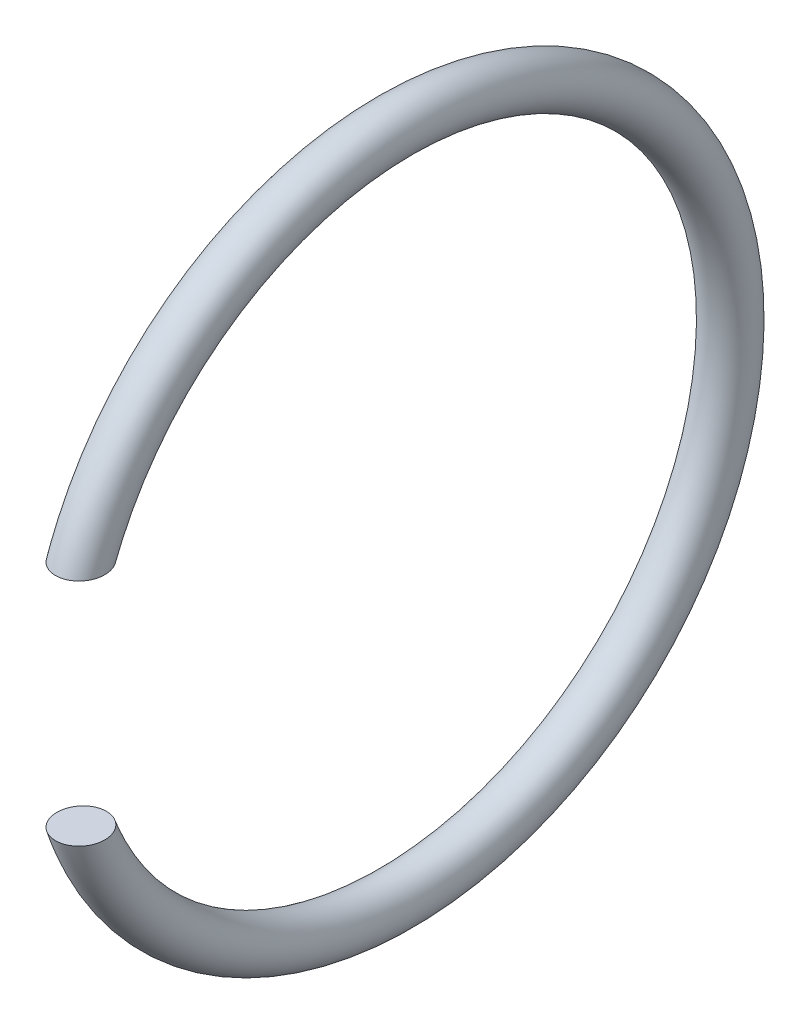
ISO-10303-21;
HEADER;
FILE_DESCRIPTION(('STEP AP214'),'2;1');
FILE_NAME('part.step','',(''),(''),'','','');
FILE_SCHEMA(('AUTOMOTIVE_DESIGN { 1 0 10303 214 1 1 1 1 }'));
ENDSEC;
DATA;
#1=APPLICATION_CONTEXT('core data for automotive mechanical design processes');
#2=APPLICATION_PROTOCOL_DEFINITION('international standard','automotive_design',2000,#1);
#3=PRODUCT_CONTEXT('',#1,'mechanical');
#4=PRODUCT('Part','Part','',(#3));
#5=PRODUCT_RELATED_PRODUCT_CATEGORY('part','',(#4));
#6=PRODUCT_DEFINITION_FORMATION('','',#4);
#7=PRODUCT_DEFINITION_CONTEXT('part definition',#1,'design');
#8=PRODUCT_DEFINITION('design','',#6,#7);
#9=PRODUCT_DEFINITION_SHAPE('','',#8);
#10=(LENGTH_UNIT() NAMED_UNIT(*) SI_UNIT(.MILLI.,.METRE.));
#11=(NAMED_UNIT(*) PLANE_ANGLE_UNIT() SI_UNIT($,.RADIAN.));
#12=(NAMED_UNIT(*) SI_UNIT($,.STERADIAN.) SOLID_ANGLE_UNIT());
#13=UNCERTAINTY_MEASURE_WITH_UNIT(LENGTH_MEASURE(1.E-05),#10,'distance_accuracy_value','');
#14=(GEOMETRIC_REPRESENTATION_CONTEXT(3) GLOBAL_UNCERTAINTY_ASSIGNED_CONTEXT((#13)) GLOBAL_UNIT_ASSIGNED_CONTEXT((#10,
#11,#12)) REPRESENTATION_CONTEXT('',''));
#15=CARTESIAN_POINT('',(0.,0.,0.));
#16=DIRECTION('',(0.,0.,1.));
#17=DIRECTION('',(1.,0.,0.));
#18=AXIS2_PLACEMENT_3D('',#15,#16,#17);
#19=CARTESIAN_POINT('',(19.0072424214337,6.00000000000001,0.));
#20=DIRECTION('',(0.,1.,0.));
#21=DIRECTION('',(1.,0.,0.));
#22=AXIS2_PLACEMENT_3D('',#19,#20,#21);
#23=PLANE('',#22);
#24=CARTESIAN_POINT('',(-1.25,5.99999999999559,16.4392822246093));
#25=CARTESIAN_POINT('',(-1.24999999948904,5.99999999999559,16.4460712429005));
#26=CARTESIAN_POINT('',(-1.2498375163337,6.00000000000493,16.4686717583032));
#27=CARTESIAN_POINT('',(-1.24860140865286,5.99999999999816,16.508364517218));
#28=CARTESIAN_POINT('',(-1.24493395243563,6.00000000000071,16.5638055618979));
#29=CARTESIAN_POINT('',(-1.23883028364897,5.99999999999984,16.6199431894502));
#30=CARTESIAN_POINT('',(-1.22902577685198,5.99999999999999,16.6846977017244));
#31=CARTESIAN_POINT('',(-1.21663679738193,5.99999999999998,16.7470604650045));
#32=CARTESIAN_POINT('',(-1.20392630441429,5.99999999999999,16.7975746310645));
#33=CARTESIAN_POINT('',(-1.18636390330316,6.00000000000014,16.85992718081));
#34=CARTESIAN_POINT('',(-1.16132027304933,5.99999999999999,16.9349301679153));
#35=CARTESIAN_POINT('',(-1.128845568859,6.00000000000002,17.0110969089417));
#36=CARTESIAN_POINT('',(-1.09309283359897,6.00000000000006,17.0848012242377));
#37=CARTESIAN_POINT('',(-1.05586562480863,6.00000000000009,17.152329374575));
#38=CARTESIAN_POINT('',(-1.0168176356841,6.00000000000001,17.2118660256357));
#39=CARTESIAN_POINT('',(-0.986069289496371,6.00000000000001,17.2550957746225));
#40=CARTESIAN_POINT('',(-0.96286079352189,5.99999999999996,17.2859775776734));
#41=CARTESIAN_POINT('',(-0.928749204176259,6.00000000000002,17.3277048826888));
#42=CARTESIAN_POINT('',(-0.896373854833484,6.00000000000009,17.3642750248076));
#43=CARTESIAN_POINT('',(-0.85235750577288,5.99999999999999,17.4102801790387));
#44=CARTESIAN_POINT('',(-0.805910789562093,6.00000000000014,17.4539332495049));
#45=CARTESIAN_POINT('',(-0.74383535463473,6.00000000000002,17.5058444568527));
#46=CARTESIAN_POINT('',(-0.699228858730718,6.00000000000001,17.5387954581922));
#47=CARTESIAN_POINT('',(-0.647344710545658,6.00000000000009,17.5736486098341));
#48=CARTESIAN_POINT('',(-0.590479318732028,6.00000000000001,17.6088780688781));
#49=CARTESIAN_POINT('',(-0.534339177089036,5.99999999999999,17.6380416156892));
#50=CARTESIAN_POINT('',(-0.455366618368598,6.00000000000002,17.6745047569591));
#51=CARTESIAN_POINT('',(-0.389296494541412,6.00000000000013,17.7001365067304));
#52=CARTESIAN_POINT('',(-0.306381112257153,6.00000000000007,17.7242757752179));
#53=CARTESIAN_POINT('',(-0.246322756055014,6.00000000000014,17.7387702159176));
#54=CARTESIAN_POINT('',(-0.189212607764413,6.00000000000014,17.7494240667185));
#55=CARTESIAN_POINT('',(-0.127871962660425,5.99999999999999,17.7575982363611));
#56=CARTESIAN_POINT('',(-0.0675128395648539,5.99999999999999,17.7627710643933));
#57=CARTESIAN_POINT('',(-0.0219897918912575,6.00000000000001,17.7641206372751));
#58=CARTESIAN_POINT('',(0.0152668271156502,6.00000000000001,17.7640542149836));
#59=CARTESIAN_POINT('',(0.0539435496721002,6.00000000000003,17.7633063054718));
#60=CARTESIAN_POINT('',(0.0993876858364148,6.00000000000009,17.7602779143511));
#61=CARTESIAN_POINT('',(0.161035341277552,6.0000000000001,17.7535706741527));
#62=CARTESIAN_POINT('',(0.226593051453221,6.00000000000001,17.7433014745263));
#63=CARTESIAN_POINT('',(0.303304200745962,6.00000000000001,17.7254566209559));
#64=CARTESIAN_POINT('',(0.39884776515698,6.00000000000001,17.6968448826941));
#65=CARTESIAN_POINT('',(0.464800435071022,6.00000000000001,17.6705696883647));
#66=CARTESIAN_POINT('',(0.555323762551591,6.00000000000001,17.6278339894727));
#67=CARTESIAN_POINT('',(0.629272937919354,6.00000000000001,17.5871509457439));
#68=CARTESIAN_POINT('',(0.711881502592455,5.99999999999999,17.5300373018721));
#69=CARTESIAN_POINT('',(0.775855005959964,6.00000000000007,17.4798302248649));
#70=CARTESIAN_POINT('',(0.825475300814275,6.00000000000003,17.4361592676733));
#71=CARTESIAN_POINT('',(0.874058191271728,6.00000000000014,17.3880733186771));
#72=CARTESIAN_POINT('',(0.900356829882116,6.00000000000001,17.3596570794839));
#73=CARTESIAN_POINT('',(0.934865045802702,6.00000000000001,17.3205993501469));
#74=CARTESIAN_POINT('',(0.985736140967527,5.99999999999999,17.2583061718641));
#75=CARTESIAN_POINT('',(1.0326122393575,6.00000000000006,17.188917794007));
#76=CARTESIAN_POINT('',(1.08526816935296,6.00000000000009,17.1003369248396));
#77=CARTESIAN_POINT('',(1.11505078526617,6.00000000000001,17.0421753076303));
#78=CARTESIAN_POINT('',(1.15598972169019,6.00000000000012,16.9470045458441));
#79=CARTESIAN_POINT('',(1.17620661392497,6.00000000000001,16.8914706091182));
#80=CARTESIAN_POINT('',(1.20260618288321,6.00000000000001,16.8045632253417));
#81=CARTESIAN_POINT('',(1.21515565440693,6.00000000000001,16.7539206106843));
#82=CARTESIAN_POINT('',(1.22964531669161,6.00000000000002,16.680410113966));
#83=CARTESIAN_POINT('',(1.23630913509142,6.0000000000001,16.6386183048956));
#84=CARTESIAN_POINT('',(1.24310234429961,5.99999999999998,16.5810368984034));
#85=CARTESIAN_POINT('',(1.24829996729937,5.99999999999998,16.5218207169747));
#86=CARTESIAN_POINT('',(1.25040141352334,6.0000000000001,16.4585602850266));
#87=CARTESIAN_POINT('',(1.2497686445754,6.00000000000006,16.4091204598925));
#88=CARTESIAN_POINT('',(1.24756988324158,6.00000000000005,16.3402709733002));
#89=CARTESIAN_POINT('',(1.24019556417104,5.99999999999999,16.260342759607));
#90=CARTESIAN_POINT('',(1.22285030808102,5.99999999999999,16.1595961332781));
#91=CARTESIAN_POINT('',(1.19987188305361,6.0000000000001,16.0591984923696));
#92=CARTESIAN_POINT('',(1.17032192100222,6.00000000000005,15.9668607113013));
#93=CARTESIAN_POINT('',(1.13190291068044,6.00000000000012,15.8716924274604));
#94=CARTESIAN_POINT('',(1.09389307052062,6.00000000000001,15.7907172225223));
#95=CARTESIAN_POINT('',(1.05582141705579,6.00000000000001,15.7238678988742));
#96=CARTESIAN_POINT('',(1.02065011407176,5.99999999999999,15.6684291649677));
#97=CARTESIAN_POINT('',(0.984589032858661,6.0000000000001,15.6152258357308));
#98=CARTESIAN_POINT('',(0.946684082851309,6.0000000000001,15.5666265674352));
#99=CARTESIAN_POINT('',(0.889288572614047,6.00000000000007,15.4994098248974));
#100=CARTESIAN_POINT('',(0.8503276643861,5.99999999999998,15.4588597269477));
#101=CARTESIAN_POINT('',(0.79095947961293,5.99999999999996,15.404412789397));
#102=CARTESIAN_POINT('',(0.747437072664513,6.00000000000005,15.3673219510643));
#103=CARTESIAN_POINT('',(0.696156358110354,6.00000000000009,15.3288578773022));
#104=CARTESIAN_POINT('',(0.63844142213949,6.00000000000007,15.2895143555653));
#105=CARTESIAN_POINT('',(0.567277984842088,5.99999999999999,15.2463303012472));
#106=CARTESIAN_POINT('',(0.494983296001193,6.00000000000007,15.2107257603079));
#107=CARTESIAN_POINT('',(0.416902079485946,5.99999999999999,15.1779544021765));
#108=CARTESIAN_POINT('',(0.352623404825367,6.00000000000001,15.1551673569665));
#109=CARTESIAN_POINT('',(0.294069088076967,6.00000000000007,15.1392380529122));
#110=CARTESIAN_POINT('',(0.234961665800972,6.00000000000012,15.125108614014));
#111=CARTESIAN_POINT('',(0.176359524617788,6.00000000000003,15.1140690836359));
#112=CARTESIAN_POINT('',(0.091706106613753,5.99999999999999,15.1045938885112));
#113=CARTESIAN_POINT('',(0.0377290170455666,6.00000000000001,15.1019618172897));
#114=CARTESIAN_POINT('',(-0.0136900358494313,6.00000000000007,15.1016069073221));
#115=CARTESIAN_POINT('',(-0.0502432405596574,6.00000000000006,15.1025056454128));
#116=CARTESIAN_POINT('',(-0.105708581606617,6.00000000000003,15.1061081296094));
#117=CARTESIAN_POINT('',(-0.146138454219426,6.00000000000001,15.1106544312443));
#118=CARTESIAN_POINT('',(-0.206391354750073,5.99999999999999,15.119675015305));
#119=CARTESIAN_POINT('',(-0.250423763403295,5.99999999999999,15.128398461892));
#120=CARTESIAN_POINT('',(-0.329375538798471,6.00000000000002,15.1483511102142));
#121=CARTESIAN_POINT('',(-0.384138181286905,6.00000000000007,15.1658884482857));
#122=CARTESIAN_POINT('',(-0.467997256879491,6.00000000000001,15.198574705182));
#123=CARTESIAN_POINT('',(-0.530669764158658,6.00000000000002,15.2275761027376));
#124=CARTESIAN_POINT('',(-0.609789811641292,6.00000000000003,15.2716222866269));
#125=CARTESIAN_POINT('',(-0.676651076816526,6.0000000000001,15.3143434613796));
#126=CARTESIAN_POINT('',(-0.740889942559081,6.00000000000002,15.3622024704481));
#127=CARTESIAN_POINT('',(-0.802116097893213,6.0000000000001,15.41373833174));
#128=CARTESIAN_POINT('',(-0.844148974375094,5.99999999999999,15.4535917159131));
#129=CARTESIAN_POINT('',(-0.887822148566541,5.99999999999998,15.498748450617));
#130=CARTESIAN_POINT('',(-0.92457538101998,6.00000000000006,15.5397505816132));
#131=CARTESIAN_POINT('',(-0.964659277602267,6.00000000000003,15.5896545502311));
#132=CARTESIAN_POINT('',(-1.01789593665713,6.0000000000001,15.6621836277221));
#133=CARTESIAN_POINT('',(-1.05478938782263,6.00000000000009,15.721379490705));
#134=CARTESIAN_POINT('',(-1.10409983848162,6.00000000000005,15.8118496941983));
#135=CARTESIAN_POINT('',(-1.14045408921405,6.00000000000006,15.8885938785113));
#136=CARTESIAN_POINT('',(-1.17567875766014,6.00000000000001,15.984232468483));
#137=CARTESIAN_POINT('',(-1.20441633986481,6.00000000000009,16.0780450149446));
#138=CARTESIAN_POINT('',(-1.22050028634751,6.00000000000009,16.1473772685133));
#139=CARTESIAN_POINT('',(-1.23498240702462,6.00000000000005,16.2304340456679));
#140=CARTESIAN_POINT('',(-1.24150172626244,5.99999999999983,16.279472814796));
#141=CARTESIAN_POINT('',(-1.24594654092519,6.00000000000017,16.3308401844162));
#142=CARTESIAN_POINT('',(-1.24855320364324,5.99999999999909,16.3704312364456));
#143=CARTESIAN_POINT('',(-1.2498076803383,6.00000000000649,16.4055855569042));
#144=CARTESIAN_POINT('',(-1.25000000050705,5.99999999999562,16.4325452555965));
#145=CARTESIAN_POINT('',(-1.25,5.99999999999559,16.4392822246093));
#146=(BOUNDED_CURVE() B_SPLINE_CURVE(3,(#24,#25,#26,#27,#28,#29,#30,#31,#32,#33,#34,#35,#36,#37,
#38,#39,#40,#41,#42,#43,#44,#45,#46,#47,#48,#49,#50,#51,#52,#53,#54,#55,#56,#57,#58,#59,#60,#61,
#62,#63,#64,#65,#66,#67,#68,#69,#70,#71,#72,#73,#74,#75,#76,#77,#78,#79,#80,#81,#82,#83,#84,#85,
#86,#87,#88,#89,#90,#91,#92,#93,#94,#95,#96,#97,#98,#99,#100,#101,#102,#103,#104,#105,#106,#107,
#108,#109,#110,#111,#112,#113,#114,#115,#116,#117,#118,#119,#120,#121,#122,#123,#124,#125,#126,
#127,#128,#129,#130,#131,#132,#133,#134,#135,#136,#137,#138,#139,#140,#141,#142,#143,#144,#145),
.UNSPECIFIED.,.T.,.F.) B_SPLINE_CURVE_WITH_KNOTS((4,1,1,1,1,1,1,1,1,1,1,1,1,1,1,1,1,1,1,1,1,1,1,
1,1,1,1,1,1,1,1,1,1,1,1,1,1,1,1,1,1,1,1,1,1,1,1,1,1,1,1,1,1,1,1,1,1,1,1,1,1,1,1,1,1,1,1,1,1,1,1,
1,1,1,1,1,1,1,1,1,1,1,1,1,1,1,1,1,1,1,1,1,1,1,1,1,1,1,1,1,1,1,1,1,1,1,1,1,1,1,1,1,1,1,1,1,1,1,1,
4),(-1.,-0.99748830897155,-0.99163835053226,-0.985308579014227,-0.976934506326966,
-0.970753753334385,-0.961086944677412,-0.953427207013681,-0.951492728047378,-0.937127426517715,
-0.924204690570156,-0.920885337921734,-0.906827528706236,-0.895708722317726,-0.894563622545929,
-0.887204975546506,-0.881423617012446,-0.874631574188783,-0.869143060136722,-0.857876910282985,
-0.851070447776254,-0.839220379612082,-0.837379979216058,-0.827952973347545,-0.814490850400339,
-0.814003774790902,-0.795780955223598,-0.788330039149886,-0.782073686187945,-0.772935497867618,
-0.766853554933367,-0.759190393331602,-0.750536435607325,-0.750015885741572,-0.745410213923499,
-0.736230109431048,-0.733178526715649,-0.722475483504466,-0.711703403808293,-0.704068700493222,
-0.685599366292559,-0.685497426359722,-0.667044123470492,-0.654439555308334,-0.648385123826268,
-0.636969025216962,-0.630005367715742,-0.623107854335521,-0.622651460166256,-0.610727463780561,
-0.593378837929119,-0.59172382412497,-0.572611349379789,-0.569248276546373,-0.553403158980579,
-0.550773389555424,-0.535651247276882,-0.534122658361268,-0.523058621908672,-0.520004845796058,
-0.512676127646979,-0.501074984924984,-0.496604875806005,-0.494388172647357,-0.47559462610792,
-0.466955499842869,-0.456583992769286,-0.43751403206267,-0.431146601959221,-0.418626341648365,
-0.404449500567075,-0.402715005477825,-0.394340633653064,-0.380682281863096,-0.379935158215248,
-0.361644895236165,-0.359914514689259,-0.350139916619246,-0.340505839917953,-0.336216966196899,
-0.324307672963824,-0.30974217583042,-0.306444180790979,-0.292990965723837,-0.284547226283528,
-0.284009857433463,-0.270513285208211,-0.26251453234641,-0.252514672623392,-0.250537451894679,
-0.243496880590605,-0.238995462232974,-0.229983189252726,-0.228457305880736,-0.216462212502356,
-0.21339399139069,-0.198338424152624,-0.19522270029554,-0.180107031457011,-0.172828850176652,
-0.161740049854657,-0.150778071555076,-0.143218495978918,-0.132146842692462,-0.129366369045701,
-0.119982189605584,-0.111787644620184,-0.105697597802964,-0.0867074631441425,
-0.0860291757619638,-0.0675854336855771,-0.0553415553560228,-0.0483537720320262,
-0.0312968334159581,-0.029043484723384,-0.0171679990048407,-0.0130092642742092,
-0.00997378499525492,-0.00249243467949462,0.),
.UNSPECIFIED.) CURVE() GEOMETRIC_REPRESENTATION_ITEM() RATIONAL_B_SPLINE_CURVE((1.,1.,1.,1.,1.,
1.,1.,1.,1.,1.,1.,1.,1.,1.,1.,1.,1.,1.,1.,1.,1.,1.,1.,1.,1.,1.,1.,1.,1.,1.,1.,1.,1.,1.,1.,1.,1.,
1.,1.,1.,1.,1.,1.,1.,1.,1.,1.,1.,1.,1.,1.,1.,1.,1.,1.,1.,1.,1.,1.,1.,1.,1.,1.,1.,1.,1.,1.,1.,1.,
1.,1.,1.,1.,1.,1.,1.,1.,1.,1.,1.,1.,1.,1.,1.,1.,1.,1.,1.,1.,1.,1.,1.,1.,1.,1.,1.,1.,1.,1.,1.,1.,
1.,1.,1.,1.,1.,1.,1.,1.,1.,1.,1.,1.,1.,1.,1.,1.,1.,1.,1.,1.,1.)) REPRESENTATION_ITEM(''));
#147=CARTESIAN_POINT('',(-1.25,5.99999999999125,16.4392822227769));
#148=VERTEX_POINT('',#147);
#149=EDGE_CURVE('E13',#148,#148,#146,.T.);
#150=ORIENTED_EDGE('',*,*,#149,.F.);
#151=EDGE_LOOP('',(#150));
#152=FACE_BOUND('',#151,.T.);
#153=ADVANCED_FACE('F24',(#152),#23,.F.);
#154=CARTESIAN_POINT('',(-19.0072424214337,-6.00000000000001,0.));
#155=DIRECTION('',(0.,-1.,0.));
#156=DIRECTION('',(-1.,0.,0.));
#157=AXIS2_PLACEMENT_3D('',#154,#155,#156);
#158=PLANE('',#157);
#159=CARTESIAN_POINT('',(-1.25,-5.99999999999563,16.4392822246093));
#160=CARTESIAN_POINT('',(-1.25000000050705,-5.99999999999556,16.4325452555964));
#161=CARTESIAN_POINT('',(-1.2498076803383,-6.0000000000066,16.4055855569042));
#162=CARTESIAN_POINT('',(-1.24855320364324,-5.99999999999895,16.3704312364455));
#163=CARTESIAN_POINT('',(-1.24594654092519,-6.0000000000002,16.3308401844161));
#164=CARTESIAN_POINT('',(-1.24150172626244,-5.9999999999998,16.2794728147959));
#165=CARTESIAN_POINT('',(-1.23498240702462,-6.00000000000003,16.2304340456679));
#166=CARTESIAN_POINT('',(-1.2205002863475,-6.00000000000002,16.1473772685132));
#167=CARTESIAN_POINT('',(-1.2044163398648,-6.00000000000005,16.0780450149446));
#168=CARTESIAN_POINT('',(-1.17567875766014,-6.00000000000001,15.9842324684829));
#169=CARTESIAN_POINT('',(-1.14045408921405,-6.00000000000006,15.8885938785113));
#170=CARTESIAN_POINT('',(-1.10409983848161,-6.00000000000001,15.8118496941983));
#171=CARTESIAN_POINT('',(-1.05478938782263,-6.00000000000001,15.721379490705));
#172=CARTESIAN_POINT('',(-1.01789593665713,-6.00000000000003,15.662183627722));
#173=CARTESIAN_POINT('',(-0.964659277602264,-6.00000000000002,15.5896545502311));
#174=CARTESIAN_POINT('',(-0.92457538101998,-6.0000000000001,15.5397505816131));
#175=CARTESIAN_POINT('',(-0.887822148566541,-6.00000000000001,15.4987484506169));
#176=CARTESIAN_POINT('',(-0.844148974375097,-6.00000000000001,15.4535917159131));
#177=CARTESIAN_POINT('',(-0.802116097893216,-6.00000000000006,15.41373833174));
#178=CARTESIAN_POINT('',(-0.740889942559081,-6.00000000000001,15.362202470448));
#179=CARTESIAN_POINT('',(-0.676651076816522,-6.00000000000001,15.3143434613796));
#180=CARTESIAN_POINT('',(-0.609789811641292,-6.00000000000001,15.2716222866268));
#181=CARTESIAN_POINT('',(-0.530669764158661,-6.00000000000001,15.2275761027375));
#182=CARTESIAN_POINT('',(-0.467997256879491,-6.00000000000001,15.198574705182));
#183=CARTESIAN_POINT('',(-0.384138181286901,-6.00000000000005,15.1658884482858));
#184=CARTESIAN_POINT('',(-0.329375538798474,-5.99999999999996,15.1483511102141));
#185=CARTESIAN_POINT('',(-0.250423763403295,-6.00000000000001,15.128398461892));
#186=CARTESIAN_POINT('',(-0.206391354750077,-5.99999999999995,15.119675015305));
#187=CARTESIAN_POINT('',(-0.14613845421943,-6.00000000000001,15.1106544312442));
#188=CARTESIAN_POINT('',(-0.10570858160662,-5.99999999999988,15.1061081296093));
#189=CARTESIAN_POINT('',(-0.0502432405596608,-6.00000000000002,15.1025056454127));
#190=CARTESIAN_POINT('',(-0.0136900358494313,-6.00000000000005,15.1016069073221));
#191=CARTESIAN_POINT('',(0.0377290170455632,-5.99999999999995,15.1019618172897));
#192=CARTESIAN_POINT('',(0.0917061066137496,-6.00000000000001,15.1045938885111));
#193=CARTESIAN_POINT('',(0.176359524617788,-6.00000000000001,15.1140690836358));
#194=CARTESIAN_POINT('',(0.234961665800972,-6.00000000000001,15.125108614014));
#195=CARTESIAN_POINT('',(0.29406908807697,-5.99999999999999,15.1392380529121));
#196=CARTESIAN_POINT('',(0.352623404825361,-6.0000000000001,15.1551673569664));
#197=CARTESIAN_POINT('',(0.416902079485942,-6.00000000000001,15.1779544021765));
#198=CARTESIAN_POINT('',(0.494983296001193,-5.99999999999999,15.2107257603078));
#199=CARTESIAN_POINT('',(0.567277984842088,-5.99999999999995,15.2463303012471));
#200=CARTESIAN_POINT('',(0.638441422139487,-6.00000000000006,15.2895143555653));
#201=CARTESIAN_POINT('',(0.69615635811035,-6.00000000000006,15.3288578773022));
#202=CARTESIAN_POINT('',(0.747437072664514,-6.00000000000006,15.3673219510642));
#203=CARTESIAN_POINT('',(0.790959479612937,-6.00000000000001,15.4044127893969));
#204=CARTESIAN_POINT('',(0.850327664386081,-6.00000000000001,15.4588597269475));
#205=CARTESIAN_POINT('',(0.889288572614028,-6.00000000000001,15.4994098248974));
#206=CARTESIAN_POINT('',(0.946684082851297,-6.00000000000005,15.5666265674352));
#207=CARTESIAN_POINT('',(0.984589032858651,-6.00000000000001,15.6152258357307));
#208=CARTESIAN_POINT('',(1.02065011407174,-6.00000000000001,15.6684291649676));
#209=CARTESIAN_POINT('',(1.05582141705578,-5.99999999999995,15.7238678988742));
#210=CARTESIAN_POINT('',(1.09389307052061,-5.99999999999998,15.7907172225223));
#211=CARTESIAN_POINT('',(1.13190291068043,-6.00000000000005,15.8716924274604));
#212=CARTESIAN_POINT('',(1.17032192100221,-6.00000000000002,15.9668607113013));
#213=CARTESIAN_POINT('',(1.1998718830536,-6.00000000000003,16.0591984923696));
#214=CARTESIAN_POINT('',(1.22285030808101,-6.00000000000001,16.1595961332781));
#215=CARTESIAN_POINT('',(1.24019556417102,-5.99999999999998,16.260342759607));
#216=CARTESIAN_POINT('',(1.24756988324157,-6.00000000000006,16.3402709733002));
#217=CARTESIAN_POINT('',(1.24976864457539,-5.99999999999999,16.4091204598924));
#218=CARTESIAN_POINT('',(1.25040141352333,-6.00000000000002,16.4585602850265));
#219=CARTESIAN_POINT('',(1.24829996729936,-6.00000000000001,16.5218207169747));
#220=CARTESIAN_POINT('',(1.2431023442996,-6.00000000000001,16.5810368984034));
#221=CARTESIAN_POINT('',(1.23630913509141,-6.00000000000002,16.6386183048955));
#222=CARTESIAN_POINT('',(1.2296453166916,-6.00000000000002,16.680410113966));
#223=CARTESIAN_POINT('',(1.21515565440692,-6.00000000000001,16.7539206106844));
#224=CARTESIAN_POINT('',(1.2026061828832,-6.00000000000005,16.8045632253418));
#225=CARTESIAN_POINT('',(1.17620661392496,-6.00000000000003,16.8914706091183));
#226=CARTESIAN_POINT('',(1.15598972169018,-6.00000000000005,16.9470045458441));
#227=CARTESIAN_POINT('',(1.11505078526616,-5.99999999999999,17.0421753076303));
#228=CARTESIAN_POINT('',(1.08526816935295,-6.00000000000003,17.1003369248396));
#229=CARTESIAN_POINT('',(1.03261223935749,-6.00000000000005,17.188917794007));
#230=CARTESIAN_POINT('',(0.985736140967489,-5.99999999999996,17.2583061718641));
#231=CARTESIAN_POINT('',(0.934865045802733,-5.99999999999994,17.320599350147));
#232=CARTESIAN_POINT('',(0.900356829882081,-6.00000000000006,17.359657079484));
#233=CARTESIAN_POINT('',(0.874058191271725,-6.00000000000007,17.3880733186772));
#234=CARTESIAN_POINT('',(0.825475300814282,-5.99999999999989,17.4361592676733));
#235=CARTESIAN_POINT('',(0.775855005959971,-6.00000000000007,17.4798302248648));
#236=CARTESIAN_POINT('',(0.711881502592458,-5.99999999999996,17.5300373018721));
#237=CARTESIAN_POINT('',(0.629272937919385,-5.99999999999994,17.5871509457441));
#238=CARTESIAN_POINT('',(0.555323762551487,-6.0000000000001,17.6278339894725));
#239=CARTESIAN_POINT('',(0.464800435071137,-5.99999999999992,17.6705696883651));
#240=CARTESIAN_POINT('',(0.398847765156959,-5.99999999999999,17.6968448826941));
#241=CARTESIAN_POINT('',(0.303304200745969,-6.00000000000002,17.725456620956));
#242=CARTESIAN_POINT('',(0.226593051453217,-5.99999999999991,17.7433014745264));
#243=CARTESIAN_POINT('',(0.161035341277552,-6.00000000000001,17.7535706741528));
#244=CARTESIAN_POINT('',(0.0993876858364183,-6.00000000000005,17.7602779143511));
#245=CARTESIAN_POINT('',(0.0539435496721002,-6.00000000000012,17.7633063054718));
#246=CARTESIAN_POINT('',(0.0152668271156536,-6.00000000000002,17.7640542149837));
#247=CARTESIAN_POINT('',(-0.021989791891254,-5.99999999999999,17.7641206372752));
#248=CARTESIAN_POINT('',(-0.0675128395648504,-6.00000000000001,17.7627710643933));
#249=CARTESIAN_POINT('',(-0.127871962660422,-5.99999999999999,17.7575982363611));
#250=CARTESIAN_POINT('',(-0.189212607764402,-6.00000000000003,17.7494240667185));
#251=CARTESIAN_POINT('',(-0.246322756055007,-6.00000000000005,17.7387702159177));
#252=CARTESIAN_POINT('',(-0.306381112257142,-6.00000000000003,17.7242757752177));
#253=CARTESIAN_POINT('',(-0.389296494541398,-6.00000000000001,17.7001365067304));
#254=CARTESIAN_POINT('',(-0.455366618368553,-6.00000000000013,17.674504756959));
#255=CARTESIAN_POINT('',(-0.534339177089033,-5.99999999999998,17.6380416156893));
#256=CARTESIAN_POINT('',(-0.590479318732014,-5.99999999999985,17.6088780688779));
#257=CARTESIAN_POINT('',(-0.647344710545648,-6.00000000000005,17.5736486098341));
#258=CARTESIAN_POINT('',(-0.699228858730718,-5.99999999999989,17.5387954581922));
#259=CARTESIAN_POINT('',(-0.743835354634723,-6.00000000000006,17.5058444568528));
#260=CARTESIAN_POINT('',(-0.805910789562089,-6.00000000000001,17.4539332495049));
#261=CARTESIAN_POINT('',(-0.852357505772873,-5.99999999999998,17.4102801790387));
#262=CARTESIAN_POINT('',(-0.896373854833474,-6.00000000000006,17.3642750248076));
#263=CARTESIAN_POINT('',(-0.928749204176255,-6.00000000000003,17.3277048826889));
#264=CARTESIAN_POINT('',(-0.962860793521883,-6.00000000000001,17.2859775776735));
#265=CARTESIAN_POINT('',(-0.986069289496364,-6.00000000000001,17.2550957746226));
#266=CARTESIAN_POINT('',(-1.0168176356841,-6.00000000000001,17.2118660256358));
#267=CARTESIAN_POINT('',(-1.05586562480862,-6.00000000000009,17.152329374575));
#268=CARTESIAN_POINT('',(-1.09309283359897,-6.00000000000006,17.0848012242377));
#269=CARTESIAN_POINT('',(-1.12884556885899,-6.00000000000002,17.0110969089417));
#270=CARTESIAN_POINT('',(-1.16132027304933,-5.99999999999999,16.9349301679153));
#271=CARTESIAN_POINT('',(-1.18636390330316,-6.00000000000007,16.8599271808101));
#272=CARTESIAN_POINT('',(-1.20392630441429,-6.00000000000001,16.7975746310645));
#273=CARTESIAN_POINT('',(-1.21663679738193,-6.00000000000002,16.7470604650046));
#274=CARTESIAN_POINT('',(-1.22902577685198,-5.99999999999998,16.6846977017244));
#275=CARTESIAN_POINT('',(-1.23883028364898,-5.99999999999978,16.6199431894502));
#276=CARTESIAN_POINT('',(-1.24493395243563,-6.00000000000087,16.5638055618979));
#277=CARTESIAN_POINT('',(-1.24860140865286,-5.99999999999805,16.508364517218));
#278=CARTESIAN_POINT('',(-1.24983751633369,-6.00000000000499,16.4686717583031));
#279=CARTESIAN_POINT('',(-1.24999999948904,-5.99999999999561,16.4460712429005));
#280=CARTESIAN_POINT('',(-1.25,-5.99999999999563,16.4392822246093));
#281=(BOUNDED_CURVE() B_SPLINE_CURVE(3,(#159,#160,#161,#162,#163,#164,#165,#166,#167,#168,#169,
#170,#171,#172,#173,#174,#175,#176,#177,#178,#179,#180,#181,#182,#183,#184,#185,#186,#187,#188,
#189,#190,#191,#192,#193,#194,#195,#196,#197,#198,#199,#200,#201,#202,#203,#204,#205,#206,#207,
#208,#209,#210,#211,#212,#213,#214,#215,#216,#217,#218,#219,#220,#221,#222,#223,#224,#225,#226,
#227,#228,#229,#230,#231,#232,#233,#234,#235,#236,#237,#238,#239,#240,#241,#242,#243,#244,#245,
#246,#247,#248,#249,#250,#251,#252,#253,#254,#255,#256,#257,#258,#259,#260,#261,#262,#263,#264,
#265,#266,#267,#268,#269,#270,#271,#272,#273,#274,#275,#276,#277,#278,#279,#280),.UNSPECIFIED.,
.T.,.F.) B_SPLINE_CURVE_WITH_KNOTS((4,1,1,1,1,1,1,1,1,1,1,1,1,1,1,1,1,1,1,1,1,1,1,1,1,1,1,1,1,1,
1,1,1,1,1,1,1,1,1,1,1,1,1,1,1,1,1,1,1,1,1,1,1,1,1,1,1,1,1,1,1,1,1,1,1,1,1,1,1,1,1,1,1,1,1,1,1,1,
1,1,1,1,1,1,1,1,1,1,1,1,1,1,1,1,1,1,1,1,1,1,1,1,1,1,1,1,1,1,1,1,1,1,1,1,1,1,1,1,1,4),(0.,
0.00249243467949618,0.009973784995255,0.0130092642742093,0.0171679990048401,0.0290434847233851,
0.0312968334159575,0.0483537720320258,0.0553415553560238,0.0675854336855782,0.0860291757619655,
0.0867074631441432,0.105697597802965,0.111787644620185,0.119982189605584,0.129366369045701,
0.132146842692462,0.143218495978918,0.150778071555077,0.161740049854657,0.172828850176652,
0.180107031457012,0.195222700295541,0.198338424152624,0.213393991390691,0.216462212502357,
0.228457305880735,0.229983189252726,0.238995462232974,0.243496880590605,0.250537451894679,
0.252514672623392,0.26251453234641,0.270513285208211,0.284009857433463,0.284547226283528,
0.292990965723838,0.306444180790979,0.30974217583042,0.324307672963824,0.336216966196899,
0.340505839917952,0.350139916619246,0.359914514689259,0.361644895236164,0.379935158215247,
0.380682281863095,0.394340633653063,0.402715005477826,0.404449500567074,0.418626341648364,
0.43114660195922,0.43751403206267,0.456583992769285,0.466955499842867,0.475594626107918,
0.494388172647353,0.496604875806002,0.501074984924984,0.512676127646968,0.520004845796054,
0.523058621908666,0.534122658361268,0.535651247276879,0.550773389555421,0.553403158980579,
0.569248276546373,0.572611349379789,0.591723824124969,0.593378837929119,0.610727463780562,
0.622651460166257,0.623107854335522,0.630005367715741,0.636969025216961,0.648385123826267,
0.654439555308334,0.667044123470492,0.685497426359722,0.685599366292558,0.704068700493221,
0.711703403808293,0.722475483504467,0.733178526715649,0.736230109431048,0.745410213923499,
0.750015885741572,0.750536435607325,0.759190393331601,0.766853554933366,0.772935497867617,
0.782073686187943,0.788330039149886,0.795780955223595,0.814003774790898,0.814490850400339,
0.827952973347542,0.837379979216057,0.839220379612081,0.851070447776254,0.857876910282985,
0.869143060136722,0.874631574188782,0.881423617012446,0.887204975546506,0.894563622545926,
0.895708722317726,0.906827528706233,0.920885337921732,0.924204690570157,0.937127426517715,
0.951492728047377,0.953427207013681,0.961086944677413,0.970753753334386,0.976934506326966,
0.985308579014226,0.991638350532261,0.997488308971548,1.),
.UNSPECIFIED.) CURVE() GEOMETRIC_REPRESENTATION_ITEM() RATIONAL_B_SPLINE_CURVE((1.,1.,1.,1.,1.,
1.,1.,1.,1.,1.,1.,1.,1.,1.,1.,1.,1.,1.,1.,1.,1.,1.,1.,1.,1.,1.,1.,1.,1.,1.,1.,1.,1.,1.,1.,1.,1.,
1.,1.,1.,1.,1.,1.,1.,1.,1.,1.,1.,1.,1.,1.,1.,1.,1.,1.,1.,1.,1.,1.,1.,1.,1.,1.,1.,1.,1.,1.,1.,1.,
1.,1.,1.,1.,1.,1.,1.,1.,1.,1.,1.,1.,1.,1.,1.,1.,1.,1.,1.,1.,1.,1.,1.,1.,1.,1.,1.,1.,1.,1.,1.,1.,
1.,1.,1.,1.,1.,1.,1.,1.,1.,1.,1.,1.,1.,1.,1.,1.,1.,1.,1.,1.,1.)) REPRESENTATION_ITEM(''));
#282=CARTESIAN_POINT('',(-1.25,-5.99999999999122,16.4392822227769));
#283=VERTEX_POINT('',#282);
#284=EDGE_CURVE('E36',#283,#283,#281,.T.);
#285=ORIENTED_EDGE('',*,*,#284,.F.);
#286=EDGE_LOOP('',(#285));
#287=FACE_BOUND('',#286,.T.);
#288=ADVANCED_FACE('F26',(#287),#158,.F.);
#289=CARTESIAN_POINT('',(0.,0.,0.));
#290=DIRECTION('',(-1.,0.,0.));
#291=DIRECTION('',(0.,0.,1.));
#292=AXIS2_PLACEMENT_3D('',#289,#290,#291);
#293=TOROIDAL_SURFACE('',#292,17.5,1.25);
#294=ORIENTED_EDGE('',*,*,#149,.T.);
#295=EDGE_LOOP('',(#294));
#296=FACE_BOUND('',#295,.T.);
#297=ORIENTED_EDGE('',*,*,#284,.T.);
#298=EDGE_LOOP('',(#297));
#299=FACE_BOUND('',#298,.T.);
#300=ADVANCED_FACE('F49',(#296,#299),#293,.T.);
#301=CLOSED_SHELL('',(#153,#288,#300));
#302=MANIFOLD_SOLID_BREP('B1',#301);
#303=ADVANCED_BREP_SHAPE_REPRESENTATION('',(#18,#302),#14);
#304=SHAPE_DEFINITION_REPRESENTATION(#9,#303);
ENDSEC;
END-ISO-10303-21;
